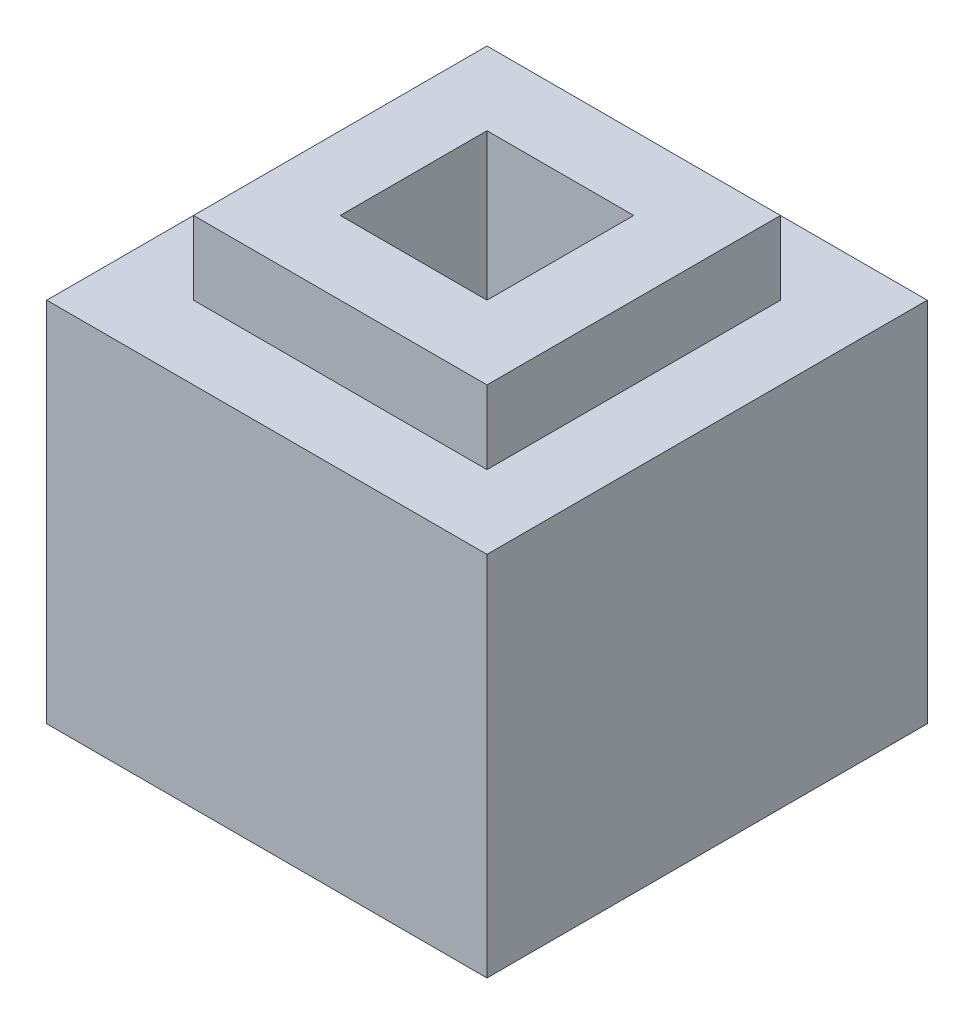
ISO-10303-21;
HEADER;
FILE_DESCRIPTION(('STEP AP214'),'2;1');
FILE_NAME('part.step','',(''),(''),'','','');
FILE_SCHEMA(('AUTOMOTIVE_DESIGN { 1 0 10303 214 1 1 1 1 }'));
ENDSEC;
DATA;
#1=APPLICATION_CONTEXT('core data for automotive mechanical design processes');
#2=APPLICATION_PROTOCOL_DEFINITION('international standard','automotive_design',2000,#1);
#3=PRODUCT_CONTEXT('',#1,'mechanical');
#4=PRODUCT('Part','Part','',(#3));
#5=PRODUCT_RELATED_PRODUCT_CATEGORY('part','',(#4));
#6=PRODUCT_DEFINITION_FORMATION('','',#4);
#7=PRODUCT_DEFINITION_CONTEXT('part definition',#1,'design');
#8=PRODUCT_DEFINITION('design','',#6,#7);
#9=PRODUCT_DEFINITION_SHAPE('','',#8);
#10=(LENGTH_UNIT() NAMED_UNIT(*) SI_UNIT(.MILLI.,.METRE.));
#11=(NAMED_UNIT(*) PLANE_ANGLE_UNIT() SI_UNIT($,.RADIAN.));
#12=(NAMED_UNIT(*) SI_UNIT($,.STERADIAN.) SOLID_ANGLE_UNIT());
#13=UNCERTAINTY_MEASURE_WITH_UNIT(LENGTH_MEASURE(1.E-05),#10,'distance_accuracy_value','');
#14=(GEOMETRIC_REPRESENTATION_CONTEXT(3) GLOBAL_UNCERTAINTY_ASSIGNED_CONTEXT((#13)) GLOBAL_UNIT_ASSIGNED_CONTEXT((#10,
#11,#12)) REPRESENTATION_CONTEXT('',''));
#15=CARTESIAN_POINT('',(0.,0.,0.));
#16=DIRECTION('',(0.,0.,1.));
#17=DIRECTION('',(1.,0.,0.));
#18=AXIS2_PLACEMENT_3D('',#15,#16,#17);
#19=CARTESIAN_POINT('',(0.,25.,0.));
#20=DIRECTION('',(0.,-1.,0.));
#21=DIRECTION('',(0.,0.,-1.));
#22=AXIS2_PLACEMENT_3D('',#19,#20,#21);
#23=PLANE('',#22);
#24=DIRECTION('',(0.,0.,1.));
#25=VECTOR('',#24,1.);
#26=CARTESIAN_POINT('',(0.,25.,0.));
#27=LINE('',#26,#25);
#28=CARTESIAN_POINT('',(0.,25.,-30.));
#29=VERTEX_POINT('',#28);
#30=CARTESIAN_POINT('',(0.,25.,0.));
#31=VERTEX_POINT('',#30);
#32=EDGE_CURVE('E222',#29,#31,#27,.T.);
#33=ORIENTED_EDGE('',*,*,#32,.T.);
#34=DIRECTION('',(1.,0.,0.));
#35=VECTOR('',#34,1.);
#36=CARTESIAN_POINT('',(0.,25.,0.));
#37=LINE('',#36,#35);
#38=CARTESIAN_POINT('',(30.,25.,0.));
#39=VERTEX_POINT('',#38);
#40=EDGE_CURVE('E225',#31,#39,#37,.T.);
#41=ORIENTED_EDGE('',*,*,#40,.T.);
#42=DIRECTION('',(0.,0.,-1.));
#43=VECTOR('',#42,1.);
#44=CARTESIAN_POINT('',(30.,25.,0.));
#45=LINE('',#44,#43);
#46=CARTESIAN_POINT('',(30.,25.,-30.));
#47=VERTEX_POINT('',#46);
#48=EDGE_CURVE('E228',#39,#47,#45,.T.);
#49=ORIENTED_EDGE('',*,*,#48,.T.);
#50=DIRECTION('',(-1.,0.,0.));
#51=VECTOR('',#50,1.);
#52=CARTESIAN_POINT('',(0.,25.,-30.));
#53=LINE('',#52,#51);
#54=EDGE_CURVE('E230',#47,#29,#53,.T.);
#55=ORIENTED_EDGE('',*,*,#54,.T.);
#56=EDGE_LOOP('',(#33,#41,#49,#55));
#57=FACE_BOUND('',#56,.T.);
#58=DIRECTION('',(0.,0.,1.));
#59=VECTOR('',#58,1.);
#60=CARTESIAN_POINT('',(4.99999999999999,25.,-25.));
#61=LINE('',#60,#59);
#62=CARTESIAN_POINT('',(4.99999999999999,25.,-25.));
#63=VERTEX_POINT('',#62);
#64=CARTESIAN_POINT('',(5.,25.,-5.));
#65=VERTEX_POINT('',#64);
#66=EDGE_CURVE('E59',#63,#65,#61,.T.);
#67=ORIENTED_EDGE('',*,*,#66,.F.);
#68=DIRECTION('',(-1.,0.,0.));
#69=VECTOR('',#68,1.);
#70=CARTESIAN_POINT('',(4.99999999999999,25.,-25.));
#71=LINE('',#70,#69);
#72=CARTESIAN_POINT('',(25.,25.,-25.));
#73=VERTEX_POINT('',#72);
#74=EDGE_CURVE('E169',#73,#63,#71,.T.);
#75=ORIENTED_EDGE('',*,*,#74,.F.);
#76=DIRECTION('',(0.,0.,-1.));
#77=VECTOR('',#76,1.);
#78=CARTESIAN_POINT('',(25.,25.,-25.));
#79=LINE('',#78,#77);
#80=CARTESIAN_POINT('',(25.,25.,-5.));
#81=VERTEX_POINT('',#80);
#82=EDGE_CURVE('E180',#81,#73,#79,.T.);
#83=ORIENTED_EDGE('',*,*,#82,.F.);
#84=DIRECTION('',(1.,0.,0.));
#85=VECTOR('',#84,1.);
#86=CARTESIAN_POINT('',(5.,25.,-5.));
#87=LINE('',#86,#85);
#88=EDGE_CURVE('E177',#65,#81,#87,.T.);
#89=ORIENTED_EDGE('',*,*,#88,.F.);
#90=EDGE_LOOP('',(#67,#75,#83,#89));
#91=FACE_BOUND('',#90,.T.);
#92=ADVANCED_FACE('F37',(#57,#91),#23,.F.);
#93=CARTESIAN_POINT('',(0.,5.,0.));
#94=DIRECTION('',(0.,-1.,0.));
#95=DIRECTION('',(0.,0.,-1.));
#96=AXIS2_PLACEMENT_3D('',#93,#94,#95);
#97=PLANE('',#96);
#98=DIRECTION('',(0.,0.,-1.));
#99=VECTOR('',#98,1.);
#100=CARTESIAN_POINT('',(15.,5.,0.));
#101=LINE('',#100,#99);
#102=CARTESIAN_POINT('',(15.,5.,-10.));
#103=VERTEX_POINT('',#102);
#104=CARTESIAN_POINT('',(15.,5.,-20.));
#105=VERTEX_POINT('',#104);
#106=EDGE_CURVE('E45',#103,#105,#101,.T.);
#107=ORIENTED_EDGE('',*,*,#106,.F.);
#108=DIRECTION('',(1.,0.,0.));
#109=VECTOR('',#108,1.);
#110=CARTESIAN_POINT('',(9.99999999999999,5.,-10.));
#111=LINE('',#110,#109);
#112=CARTESIAN_POINT('',(20.,5.,-10.));
#113=VERTEX_POINT('',#112);
#114=EDGE_CURVE('E211',#103,#113,#111,.T.);
#115=ORIENTED_EDGE('',*,*,#114,.T.);
#116=DIRECTION('',(0.,0.,-1.));
#117=VECTOR('',#116,1.);
#118=CARTESIAN_POINT('',(20.,5.,-10.));
#119=LINE('',#118,#117);
#120=CARTESIAN_POINT('',(20.,5.,-20.));
#121=VERTEX_POINT('',#120);
#122=EDGE_CURVE('E146',#113,#121,#119,.T.);
#123=ORIENTED_EDGE('',*,*,#122,.T.);
#124=DIRECTION('',(-1.,0.,0.));
#125=VECTOR('',#124,1.);
#126=CARTESIAN_POINT('',(9.99999999999999,5.,-20.));
#127=LINE('',#126,#125);
#128=EDGE_CURVE('E214',#121,#105,#127,.T.);
#129=ORIENTED_EDGE('',*,*,#128,.T.);
#130=EDGE_LOOP('',(#107,#115,#123,#129));
#131=FACE_BOUND('',#130,.T.);
#132=ADVANCED_FACE('F261',(#131),#97,.F.);
#133=CARTESIAN_POINT('',(0.,25.,0.));
#134=DIRECTION('',(1.,0.,0.));
#135=DIRECTION('',(0.,0.,-1.));
#136=AXIS2_PLACEMENT_3D('',#133,#134,#135);
#137=PLANE('',#136);
#138=CARTESIAN_POINT('',(0.,10.,-15.));
#139=DIRECTION('',(-1.,0.,0.));
#140=DIRECTION('',(0.,0.,1.));
#141=AXIS2_PLACEMENT_3D('',#138,#139,#140);
#142=CIRCLE('',#141,8.);
#143=CARTESIAN_POINT('',(0.,10.,-7.));
#144=VERTEX_POINT('',#143);
#145=EDGE_CURVE('E195',#144,#144,#142,.T.);
#146=ORIENTED_EDGE('',*,*,#145,.F.);
#147=EDGE_LOOP('',(#146));
#148=FACE_BOUND('',#147,.T.);
#149=DIRECTION('',(0.,0.,1.));
#150=VECTOR('',#149,1.);
#151=CARTESIAN_POINT('',(0.,0.,0.));
#152=LINE('',#151,#150);
#153=CARTESIAN_POINT('',(0.,0.,-30.));
#154=VERTEX_POINT('',#153);
#155=CARTESIAN_POINT('',(0.,0.,0.));
#156=VERTEX_POINT('',#155);
#157=EDGE_CURVE('E219',#154,#156,#152,.T.);
#158=ORIENTED_EDGE('',*,*,#157,.T.);
#159=DIRECTION('',(0.,-1.,0.));
#160=VECTOR('',#159,1.);
#161=CARTESIAN_POINT('',(0.,25.,0.));
#162=LINE('',#161,#160);
#163=EDGE_CURVE('E248',#31,#156,#162,.T.);
#164=ORIENTED_EDGE('',*,*,#163,.F.);
#165=ORIENTED_EDGE('',*,*,#32,.F.);
#166=DIRECTION('',(0.,-1.,0.));
#167=VECTOR('',#166,1.);
#168=CARTESIAN_POINT('',(0.,25.,-30.));
#169=LINE('',#168,#167);
#170=EDGE_CURVE('E232',#29,#154,#169,.T.);
#171=ORIENTED_EDGE('',*,*,#170,.T.);
#172=EDGE_LOOP('',(#158,#164,#165,#171));
#173=FACE_BOUND('',#172,.T.);
#174=ADVANCED_FACE('F39',(#148,#173),#137,.F.);
#175=CARTESIAN_POINT('',(0.,25.,0.));
#176=DIRECTION('',(0.,0.,-1.));
#177=DIRECTION('',(-1.,0.,0.));
#178=AXIS2_PLACEMENT_3D('',#175,#176,#177);
#179=PLANE('',#178);
#180=DIRECTION('',(1.,0.,0.));
#181=VECTOR('',#180,1.);
#182=CARTESIAN_POINT('',(0.,0.,0.));
#183=LINE('',#182,#181);
#184=CARTESIAN_POINT('',(30.,0.,0.));
#185=VERTEX_POINT('',#184);
#186=EDGE_CURVE('E235',#156,#185,#183,.T.);
#187=ORIENTED_EDGE('',*,*,#186,.T.);
#188=DIRECTION('',(0.,-1.,0.));
#189=VECTOR('',#188,1.);
#190=CARTESIAN_POINT('',(30.,25.,0.));
#191=LINE('',#190,#189);
#192=EDGE_CURVE('E245',#39,#185,#191,.T.);
#193=ORIENTED_EDGE('',*,*,#192,.F.);
#194=ORIENTED_EDGE('',*,*,#40,.F.);
#195=ORIENTED_EDGE('',*,*,#163,.T.);
#196=EDGE_LOOP('',(#187,#193,#194,#195));
#197=FACE_BOUND('',#196,.T.);
#198=ADVANCED_FACE('F294',(#197),#179,.F.);
#199=CARTESIAN_POINT('',(30.,25.,0.));
#200=DIRECTION('',(-1.,0.,0.));
#201=DIRECTION('',(0.,0.,1.));
#202=AXIS2_PLACEMENT_3D('',#199,#200,#201);
#203=PLANE('',#202);
#204=DIRECTION('',(0.,0.,-1.));
#205=VECTOR('',#204,1.);
#206=CARTESIAN_POINT('',(30.,0.,0.));
#207=LINE('',#206,#205);
#208=CARTESIAN_POINT('',(30.,0.,-30.));
#209=VERTEX_POINT('',#208);
#210=EDGE_CURVE('E237',#185,#209,#207,.T.);
#211=ORIENTED_EDGE('',*,*,#210,.T.);
#212=DIRECTION('',(0.,-1.,0.));
#213=VECTOR('',#212,1.);
#214=CARTESIAN_POINT('',(30.,25.,-30.));
#215=LINE('',#214,#213);
#216=EDGE_CURVE('E242',#47,#209,#215,.T.);
#217=ORIENTED_EDGE('',*,*,#216,.F.);
#218=ORIENTED_EDGE('',*,*,#48,.F.);
#219=ORIENTED_EDGE('',*,*,#192,.T.);
#220=EDGE_LOOP('',(#211,#217,#218,#219));
#221=FACE_BOUND('',#220,.T.);
#222=ADVANCED_FACE('F291',(#221),#203,.F.);
#223=CARTESIAN_POINT('',(0.,25.,-30.));
#224=DIRECTION('',(0.,0.,1.));
#225=DIRECTION('',(1.,0.,0.));
#226=AXIS2_PLACEMENT_3D('',#223,#224,#225);
#227=PLANE('',#226);
#228=DIRECTION('',(-1.,0.,0.));
#229=VECTOR('',#228,1.);
#230=CARTESIAN_POINT('',(0.,0.,-30.));
#231=LINE('',#230,#229);
#232=EDGE_CURVE('E226',#209,#154,#231,.T.);
#233=ORIENTED_EDGE('',*,*,#232,.T.);
#234=ORIENTED_EDGE('',*,*,#170,.F.);
#235=ORIENTED_EDGE('',*,*,#54,.F.);
#236=ORIENTED_EDGE('',*,*,#216,.T.);
#237=EDGE_LOOP('',(#233,#234,#235,#236));
#238=FACE_BOUND('',#237,.T.);
#239=ADVANCED_FACE('F287',(#238),#227,.F.);
#240=CARTESIAN_POINT('',(0.,0.,0.));
#241=DIRECTION('',(0.,-1.,0.));
#242=DIRECTION('',(0.,0.,-1.));
#243=AXIS2_PLACEMENT_3D('',#240,#241,#242);
#244=PLANE('',#243);
#245=ORIENTED_EDGE('',*,*,#157,.F.);
#246=ORIENTED_EDGE('',*,*,#232,.F.);
#247=ORIENTED_EDGE('',*,*,#210,.F.);
#248=ORIENTED_EDGE('',*,*,#186,.F.);
#249=EDGE_LOOP('',(#245,#246,#247,#248));
#250=FACE_BOUND('',#249,.T.);
#251=ADVANCED_FACE('F284',(#250),#244,.T.);
#252=CARTESIAN_POINT('',(9.99999999999999,5.,-10.));
#253=DIRECTION('',(-1.,0.,0.));
#254=DIRECTION('',(0.,0.,1.));
#255=AXIS2_PLACEMENT_3D('',#252,#253,#254);
#256=PLANE('',#255);
#257=DIRECTION('',(0.,1.,0.));
#258=VECTOR('',#257,1.);
#259=CARTESIAN_POINT('',(9.99999999999999,5.,-10.));
#260=LINE('',#259,#258);
#261=CARTESIAN_POINT('',(9.99999999999999,16.2449979983984,-10.));
#262=VERTEX_POINT('',#261);
#263=CARTESIAN_POINT('',(10.,30.,-10.));
#264=VERTEX_POINT('',#263);
#265=EDGE_CURVE('E51',#262,#264,#260,.T.);
#266=ORIENTED_EDGE('',*,*,#265,.F.);
#267=CARTESIAN_POINT('',(9.99999999999999,10.,-15.));
#268=DIRECTION('',(-1.,0.,0.));
#269=DIRECTION('',(0.,0.,1.));
#270=AXIS2_PLACEMENT_3D('',#267,#268,#269);
#271=CIRCLE('',#270,8.);
#272=CARTESIAN_POINT('',(9.99999999999999,16.2449979983984,-20.));
#273=VERTEX_POINT('',#272);
#274=EDGE_CURVE('E205',#262,#273,#271,.T.);
#275=ORIENTED_EDGE('',*,*,#274,.T.);
#276=DIRECTION('',(0.,1.,0.));
#277=VECTOR('',#276,1.);
#278=CARTESIAN_POINT('',(9.99999999999999,5.,-20.));
#279=LINE('',#278,#277);
#280=CARTESIAN_POINT('',(9.99999999999999,30.,-20.));
#281=VERTEX_POINT('',#280);
#282=EDGE_CURVE('E217',#273,#281,#279,.T.);
#283=ORIENTED_EDGE('',*,*,#282,.T.);
#284=DIRECTION('',(0.,0.,1.));
#285=VECTOR('',#284,1.);
#286=CARTESIAN_POINT('',(9.99999999999999,30.,-20.));
#287=LINE('',#286,#285);
#288=EDGE_CURVE('E155',#281,#264,#287,.T.);
#289=ORIENTED_EDGE('',*,*,#288,.T.);
#290=EDGE_LOOP('',(#266,#275,#283,#289));
#291=FACE_BOUND('',#290,.T.);
#292=ADVANCED_FACE('F264',(#291),#256,.F.);
#293=CARTESIAN_POINT('',(9.99999999999999,5.,-20.));
#294=DIRECTION('',(0.,0.,-1.));
#295=DIRECTION('',(-1.,0.,0.));
#296=AXIS2_PLACEMENT_3D('',#293,#294,#295);
#297=PLANE('',#296);
#298=DIRECTION('',(-1.,0.,0.));
#299=VECTOR('',#298,1.);
#300=CARTESIAN_POINT('',(15.,16.2449979983984,-20.));
#301=LINE('',#300,#299);
#302=CARTESIAN_POINT('',(15.,16.2449979983984,-20.));
#303=VERTEX_POINT('',#302);
#304=EDGE_CURVE('E208',#273,#303,#301,.F.);
#305=ORIENTED_EDGE('',*,*,#304,.T.);
#306=DIRECTION('',(0.,1.,0.));
#307=VECTOR('',#306,1.);
#308=CARTESIAN_POINT('',(15.,5.,-20.));
#309=LINE('',#308,#307);
#310=EDGE_CURVE('E203',#105,#303,#309,.T.);
#311=ORIENTED_EDGE('',*,*,#310,.F.);
#312=ORIENTED_EDGE('',*,*,#128,.F.);
#313=DIRECTION('',(0.,1.,0.));
#314=VECTOR('',#313,1.);
#315=CARTESIAN_POINT('',(20.,5.,-20.));
#316=LINE('',#315,#314);
#317=CARTESIAN_POINT('',(20.,30.,-20.));
#318=VERTEX_POINT('',#317);
#319=EDGE_CURVE('E148',#121,#318,#316,.T.);
#320=ORIENTED_EDGE('',*,*,#319,.T.);
#321=DIRECTION('',(-1.,0.,0.));
#322=VECTOR('',#321,1.);
#323=CARTESIAN_POINT('',(9.99999999999999,30.,-20.));
#324=LINE('',#323,#322);
#325=EDGE_CURVE('E160',#318,#281,#324,.T.);
#326=ORIENTED_EDGE('',*,*,#325,.T.);
#327=ORIENTED_EDGE('',*,*,#282,.F.);
#328=EDGE_LOOP('',(#305,#311,#312,#320,#326,#327));
#329=FACE_BOUND('',#328,.T.);
#330=ADVANCED_FACE('F259',(#329),#297,.F.);
#331=CARTESIAN_POINT('',(20.,5.,-10.));
#332=DIRECTION('',(1.,0.,0.));
#333=DIRECTION('',(0.,0.,-1.));
#334=AXIS2_PLACEMENT_3D('',#331,#332,#333);
#335=PLANE('',#334);
#336=DIRECTION('',(0.,0.,-1.));
#337=VECTOR('',#336,1.);
#338=CARTESIAN_POINT('',(20.,30.,-20.));
#339=LINE('',#338,#337);
#340=CARTESIAN_POINT('',(20.,30.,-10.));
#341=VERTEX_POINT('',#340);
#342=EDGE_CURVE('E143',#341,#318,#339,.T.);
#343=ORIENTED_EDGE('',*,*,#342,.T.);
#344=ORIENTED_EDGE('',*,*,#319,.F.);
#345=ORIENTED_EDGE('',*,*,#122,.F.);
#346=DIRECTION('',(0.,1.,0.));
#347=VECTOR('',#346,1.);
#348=CARTESIAN_POINT('',(20.,5.,-10.));
#349=LINE('',#348,#347);
#350=EDGE_CURVE('E140',#113,#341,#349,.T.);
#351=ORIENTED_EDGE('',*,*,#350,.T.);
#352=EDGE_LOOP('',(#343,#344,#345,#351));
#353=FACE_BOUND('',#352,.T.);
#354=ADVANCED_FACE('F141',(#353),#335,.F.);
#355=CARTESIAN_POINT('',(9.99999999999999,5.,-10.));
#356=DIRECTION('',(0.,0.,1.));
#357=DIRECTION('',(1.,0.,0.));
#358=AXIS2_PLACEMENT_3D('',#355,#356,#357);
#359=PLANE('',#358);
#360=DIRECTION('',(1.,0.,0.));
#361=VECTOR('',#360,1.);
#362=CARTESIAN_POINT('',(10.,30.,-10.));
#363=LINE('',#362,#361);
#364=EDGE_CURVE('E151',#264,#341,#363,.T.);
#365=ORIENTED_EDGE('',*,*,#364,.T.);
#366=ORIENTED_EDGE('',*,*,#350,.F.);
#367=ORIENTED_EDGE('',*,*,#114,.F.);
#368=DIRECTION('',(0.,-1.,0.));
#369=VECTOR('',#368,1.);
#370=CARTESIAN_POINT('',(15.,5.,-10.));
#371=LINE('',#370,#369);
#372=CARTESIAN_POINT('',(15.,16.2449979983984,-10.));
#373=VERTEX_POINT('',#372);
#374=EDGE_CURVE('E199',#373,#103,#371,.T.);
#375=ORIENTED_EDGE('',*,*,#374,.F.);
#376=DIRECTION('',(-1.,0.,0.));
#377=VECTOR('',#376,1.);
#378=CARTESIAN_POINT('',(15.,16.2449979983984,-10.));
#379=LINE('',#378,#377);
#380=EDGE_CURVE('E11',#373,#262,#379,.T.);
#381=ORIENTED_EDGE('',*,*,#380,.T.);
#382=ORIENTED_EDGE('',*,*,#265,.T.);
#383=EDGE_LOOP('',(#365,#366,#367,#375,#381,#382));
#384=FACE_BOUND('',#383,.T.);
#385=ADVANCED_FACE('F152',(#384),#359,.F.);
#386=CARTESIAN_POINT('',(15.,10.,-15.));
#387=DIRECTION('',(-1.,0.,0.));
#388=DIRECTION('',(0.,0.,1.));
#389=AXIS2_PLACEMENT_3D('',#386,#387,#388);
#390=CYLINDRICAL_SURFACE('',#389,8.);
#391=ORIENTED_EDGE('',*,*,#145,.T.);
#392=EDGE_LOOP('',(#391));
#393=FACE_BOUND('',#392,.T.);
#394=ORIENTED_EDGE('',*,*,#274,.F.);
#395=ORIENTED_EDGE('',*,*,#380,.F.);
#396=CARTESIAN_POINT('',(15.,10.,-15.));
#397=DIRECTION('',(-1.,0.,0.));
#398=DIRECTION('',(0.,0.,1.));
#399=AXIS2_PLACEMENT_3D('',#396,#397,#398);
#400=CIRCLE('',#399,8.);
#401=EDGE_CURVE('E196',#303,#373,#400,.T.);
#402=ORIENTED_EDGE('',*,*,#401,.F.);
#403=ORIENTED_EDGE('',*,*,#304,.F.);
#404=EDGE_LOOP('',(#394,#395,#402,#403));
#405=FACE_BOUND('',#404,.T.);
#406=ADVANCED_FACE('F265',(#393,#405),#390,.F.);
#407=CARTESIAN_POINT('',(15.,10.,-15.));
#408=DIRECTION('',(-1.,0.,0.));
#409=DIRECTION('',(0.,0.,1.));
#410=AXIS2_PLACEMENT_3D('',#407,#408,#409);
#411=PLANE('',#410);
#412=ORIENTED_EDGE('',*,*,#310,.T.);
#413=ORIENTED_EDGE('',*,*,#401,.T.);
#414=ORIENTED_EDGE('',*,*,#374,.T.);
#415=ORIENTED_EDGE('',*,*,#106,.T.);
#416=EDGE_LOOP('',(#412,#413,#414,#415));
#417=FACE_BOUND('',#416,.T.);
#418=ADVANCED_FACE('F253',(#417),#411,.T.);
#419=CARTESIAN_POINT('',(0.,30.,0.));
#420=DIRECTION('',(0.,1.,0.));
#421=DIRECTION('',(0.,0.,1.));
#422=AXIS2_PLACEMENT_3D('',#419,#420,#421);
#423=PLANE('',#422);
#424=ORIENTED_EDGE('',*,*,#288,.F.);
#425=ORIENTED_EDGE('',*,*,#325,.F.);
#426=ORIENTED_EDGE('',*,*,#342,.F.);
#427=ORIENTED_EDGE('',*,*,#364,.F.);
#428=EDGE_LOOP('',(#424,#425,#426,#427));
#429=FACE_BOUND('',#428,.T.);
#430=DIRECTION('',(0.,0.,1.));
#431=VECTOR('',#430,1.);
#432=CARTESIAN_POINT('',(4.99999999999999,30.,-25.));
#433=LINE('',#432,#431);
#434=CARTESIAN_POINT('',(4.99999999999999,30.,-25.));
#435=VERTEX_POINT('',#434);
#436=CARTESIAN_POINT('',(5.,30.,-5.));
#437=VERTEX_POINT('',#436);
#438=EDGE_CURVE('E165',#435,#437,#433,.T.);
#439=ORIENTED_EDGE('',*,*,#438,.T.);
#440=DIRECTION('',(1.,0.,0.));
#441=VECTOR('',#440,1.);
#442=CARTESIAN_POINT('',(5.,30.,-5.));
#443=LINE('',#442,#441);
#444=CARTESIAN_POINT('',(25.,30.,-5.));
#445=VERTEX_POINT('',#444);
#446=EDGE_CURVE('E168',#437,#445,#443,.T.);
#447=ORIENTED_EDGE('',*,*,#446,.T.);
#448=DIRECTION('',(0.,0.,-1.));
#449=VECTOR('',#448,1.);
#450=CARTESIAN_POINT('',(25.,30.,-25.));
#451=LINE('',#450,#449);
#452=CARTESIAN_POINT('',(25.,30.,-25.));
#453=VERTEX_POINT('',#452);
#454=EDGE_CURVE('E171',#445,#453,#451,.T.);
#455=ORIENTED_EDGE('',*,*,#454,.T.);
#456=DIRECTION('',(-1.,0.,0.));
#457=VECTOR('',#456,1.);
#458=CARTESIAN_POINT('',(4.99999999999999,30.,-25.));
#459=LINE('',#458,#457);
#460=EDGE_CURVE('E173',#453,#435,#459,.T.);
#461=ORIENTED_EDGE('',*,*,#460,.T.);
#462=EDGE_LOOP('',(#439,#447,#455,#461));
#463=FACE_BOUND('',#462,.T.);
#464=ADVANCED_FACE('F157',(#429,#463),#423,.T.);
#465=CARTESIAN_POINT('',(4.99999999999999,30.,-25.));
#466=DIRECTION('',(0.,0.,1.));
#467=DIRECTION('',(1.,0.,0.));
#468=AXIS2_PLACEMENT_3D('',#465,#466,#467);
#469=PLANE('',#468);
#470=ORIENTED_EDGE('',*,*,#74,.T.);
#471=DIRECTION('',(0.,-1.,0.));
#472=VECTOR('',#471,1.);
#473=CARTESIAN_POINT('',(4.99999999999999,30.,-25.));
#474=LINE('',#473,#472);
#475=EDGE_CURVE('E175',#435,#63,#474,.T.);
#476=ORIENTED_EDGE('',*,*,#475,.F.);
#477=ORIENTED_EDGE('',*,*,#460,.F.);
#478=DIRECTION('',(0.,-1.,0.));
#479=VECTOR('',#478,1.);
#480=CARTESIAN_POINT('',(25.,30.,-25.));
#481=LINE('',#480,#479);
#482=EDGE_CURVE('E186',#453,#73,#481,.T.);
#483=ORIENTED_EDGE('',*,*,#482,.T.);
#484=EDGE_LOOP('',(#470,#476,#477,#483));
#485=FACE_BOUND('',#484,.T.);
#486=ADVANCED_FACE('F386',(#485),#469,.F.);
#487=CARTESIAN_POINT('',(25.,30.,-25.));
#488=DIRECTION('',(-1.,0.,0.));
#489=DIRECTION('',(0.,0.,1.));
#490=AXIS2_PLACEMENT_3D('',#487,#488,#489);
#491=PLANE('',#490);
#492=ORIENTED_EDGE('',*,*,#82,.T.);
#493=ORIENTED_EDGE('',*,*,#482,.F.);
#494=ORIENTED_EDGE('',*,*,#454,.F.);
#495=DIRECTION('',(0.,-1.,0.));
#496=VECTOR('',#495,1.);
#497=CARTESIAN_POINT('',(25.,30.,-5.));
#498=LINE('',#497,#496);
#499=EDGE_CURVE('E189',#445,#81,#498,.T.);
#500=ORIENTED_EDGE('',*,*,#499,.T.);
#501=EDGE_LOOP('',(#492,#493,#494,#500));
#502=FACE_BOUND('',#501,.T.);
#503=ADVANCED_FACE('F396',(#502),#491,.F.);
#504=CARTESIAN_POINT('',(5.,30.,-5.));
#505=DIRECTION('',(0.,0.,-1.));
#506=DIRECTION('',(-1.,0.,0.));
#507=AXIS2_PLACEMENT_3D('',#504,#505,#506);
#508=PLANE('',#507);
#509=ORIENTED_EDGE('',*,*,#88,.T.);
#510=ORIENTED_EDGE('',*,*,#499,.F.);
#511=ORIENTED_EDGE('',*,*,#446,.F.);
#512=DIRECTION('',(0.,-1.,0.));
#513=VECTOR('',#512,1.);
#514=CARTESIAN_POINT('',(5.,30.,-5.));
#515=LINE('',#514,#513);
#516=EDGE_CURVE('E192',#437,#65,#515,.T.);
#517=ORIENTED_EDGE('',*,*,#516,.T.);
#518=EDGE_LOOP('',(#509,#510,#511,#517));
#519=FACE_BOUND('',#518,.T.);
#520=ADVANCED_FACE('F403',(#519),#508,.F.);
#521=CARTESIAN_POINT('',(4.99999999999999,30.,-25.));
#522=DIRECTION('',(1.,0.,0.));
#523=DIRECTION('',(0.,0.,-1.));
#524=AXIS2_PLACEMENT_3D('',#521,#522,#523);
#525=PLANE('',#524);
#526=ORIENTED_EDGE('',*,*,#66,.T.);
#527=ORIENTED_EDGE('',*,*,#516,.F.);
#528=ORIENTED_EDGE('',*,*,#438,.F.);
#529=ORIENTED_EDGE('',*,*,#475,.T.);
#530=EDGE_LOOP('',(#526,#527,#528,#529));
#531=FACE_BOUND('',#530,.T.);
#532=ADVANCED_FACE('F411',(#531),#525,.F.);
#533=CLOSED_SHELL('',(#92,#132,#174,#198,#222,#239,#251,#292,#330,#354,#385,#406,#418,#464,#486,
#503,#520,#532));
#534=MANIFOLD_SOLID_BREP('B2',#533);
#535=ADVANCED_BREP_SHAPE_REPRESENTATION('',(#18,#534),#14);
#536=SHAPE_DEFINITION_REPRESENTATION(#9,#535);
ENDSEC;
END-ISO-10303-21;
